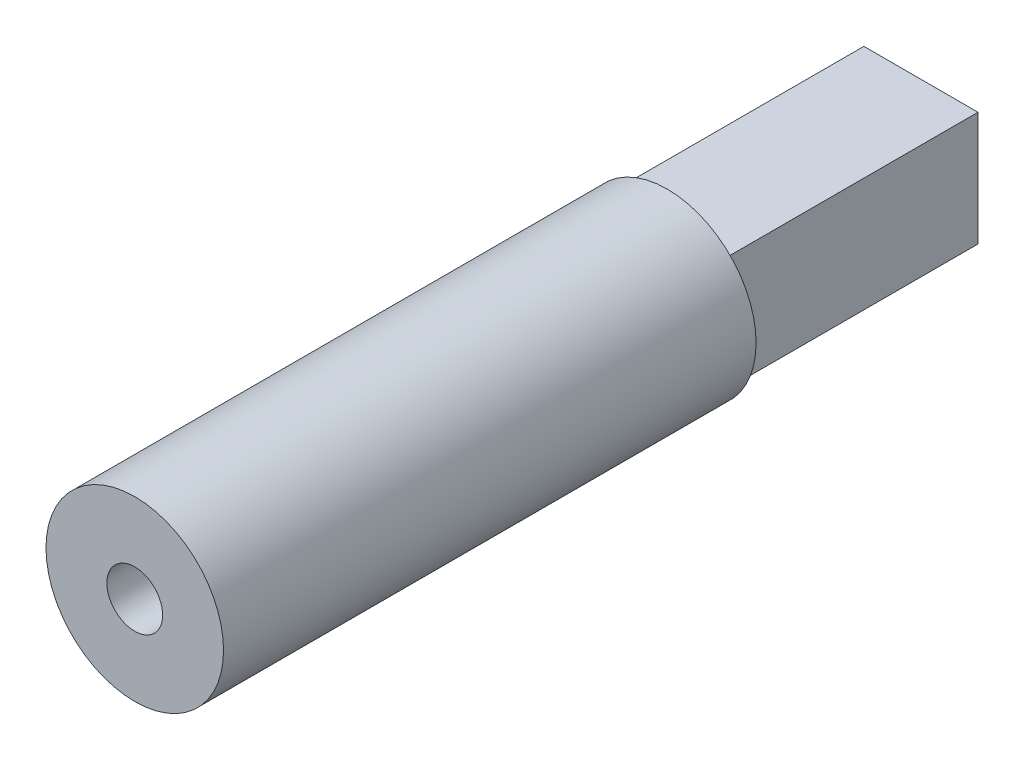
ISO-10303-21;
HEADER;
FILE_DESCRIPTION(('STEP AP214'),'2;1');
FILE_NAME('part.step','',(''),(''),'','','');
FILE_SCHEMA(('AUTOMOTIVE_DESIGN { 1 0 10303 214 1 1 1 1 }'));
ENDSEC;
DATA;
#1=APPLICATION_CONTEXT('core data for automotive mechanical design processes');
#2=APPLICATION_PROTOCOL_DEFINITION('international standard','automotive_design',2000,#1);
#3=PRODUCT_CONTEXT('',#1,'mechanical');
#4=PRODUCT('Part','Part','',(#3));
#5=PRODUCT_RELATED_PRODUCT_CATEGORY('part','',(#4));
#6=PRODUCT_DEFINITION_FORMATION('','',#4);
#7=PRODUCT_DEFINITION_CONTEXT('part definition',#1,'design');
#8=PRODUCT_DEFINITION('design','',#6,#7);
#9=PRODUCT_DEFINITION_SHAPE('','',#8);
#10=(LENGTH_UNIT() NAMED_UNIT(*) SI_UNIT(.MILLI.,.METRE.));
#11=(NAMED_UNIT(*) PLANE_ANGLE_UNIT() SI_UNIT($,.RADIAN.));
#12=(NAMED_UNIT(*) SI_UNIT($,.STERADIAN.) SOLID_ANGLE_UNIT());
#13=UNCERTAINTY_MEASURE_WITH_UNIT(LENGTH_MEASURE(1.E-05),#10,'distance_accuracy_value','');
#14=(GEOMETRIC_REPRESENTATION_CONTEXT(3) GLOBAL_UNCERTAINTY_ASSIGNED_CONTEXT((#13)) GLOBAL_UNIT_ASSIGNED_CONTEXT((#10,
#11,#12)) REPRESENTATION_CONTEXT('',''));
#15=CARTESIAN_POINT('',(0.,0.,0.));
#16=DIRECTION('',(0.,0.,1.));
#17=DIRECTION('',(1.,0.,0.));
#18=AXIS2_PLACEMENT_3D('',#15,#16,#17);
#19=CARTESIAN_POINT('',(0.,0.,31.));
#20=DIRECTION('',(0.,0.,-1.));
#21=DIRECTION('',(-1.,0.,0.));
#22=AXIS2_PLACEMENT_3D('',#19,#20,#21);
#23=CYLINDRICAL_SURFACE('',#22,3.5);
#24=CARTESIAN_POINT('',(0.,0.,31.));
#25=DIRECTION('',(0.,0.,1.));
#26=DIRECTION('',(1.,0.,0.));
#27=AXIS2_PLACEMENT_3D('',#24,#25,#26);
#28=CIRCLE('',#27,3.5);
#29=CARTESIAN_POINT('',(3.5,0.,31.));
#30=VERTEX_POINT('',#29);
#31=EDGE_CURVE('E11',#30,#30,#28,.T.);
#32=ORIENTED_EDGE('',*,*,#31,.F.);
#33=EDGE_LOOP('',(#32));
#34=FACE_BOUND('',#33,.T.);
#35=CARTESIAN_POINT('',(0.,0.,10.));
#36=DIRECTION('',(0.,0.,-1.));
#37=DIRECTION('',(-1.,0.,0.));
#38=AXIS2_PLACEMENT_3D('',#35,#36,#37);
#39=CIRCLE('',#38,3.5);
#40=CARTESIAN_POINT('',(-3.5,0.,10.));
#41=VERTEX_POINT('',#40);
#42=EDGE_CURVE('E48',#41,#41,#39,.T.);
#43=ORIENTED_EDGE('',*,*,#42,.F.);
#44=EDGE_LOOP('',(#43));
#45=FACE_BOUND('',#44,.T.);
#46=ADVANCED_FACE('F41',(#34,#45),#23,.T.);
#47=CARTESIAN_POINT('',(0.,0.,31.));
#48=DIRECTION('',(0.,0.,1.));
#49=DIRECTION('',(1.,0.,0.));
#50=AXIS2_PLACEMENT_3D('',#47,#48,#49);
#51=PLANE('',#50);
#52=CARTESIAN_POINT('',(0.,0.,31.));
#53=DIRECTION('',(0.,0.,1.));
#54=DIRECTION('',(1.,0.,0.));
#55=AXIS2_PLACEMENT_3D('',#52,#53,#54);
#56=CIRCLE('',#55,1.1);
#57=CARTESIAN_POINT('',(1.1,0.,31.));
#58=VERTEX_POINT('',#57);
#59=EDGE_CURVE('E108',#58,#58,#56,.T.);
#60=ORIENTED_EDGE('',*,*,#59,.F.);
#61=EDGE_LOOP('',(#60));
#62=FACE_BOUND('',#61,.T.);
#63=ORIENTED_EDGE('',*,*,#31,.T.);
#64=EDGE_LOOP('',(#63));
#65=FACE_BOUND('',#64,.T.);
#66=ADVANCED_FACE('F125',(#62,#65),#51,.T.);
#67=CARTESIAN_POINT('',(0.,0.,10.));
#68=DIRECTION('',(0.,0.,-1.));
#69=DIRECTION('',(-1.,0.,0.));
#70=AXIS2_PLACEMENT_3D('',#67,#68,#69);
#71=PLANE('',#70);
#72=DIRECTION('',(-1.,0.,0.));
#73=VECTOR('',#72,1.);
#74=CARTESIAN_POINT('',(2.25,-2.25,10.));
#75=LINE('',#74,#73);
#76=CARTESIAN_POINT('',(2.25,-2.25,10.));
#77=VERTEX_POINT('',#76);
#78=CARTESIAN_POINT('',(-2.25,-2.25,10.));
#79=VERTEX_POINT('',#78);
#80=EDGE_CURVE('E93',#77,#79,#75,.T.);
#81=ORIENTED_EDGE('',*,*,#80,.F.);
#82=DIRECTION('',(0.,-1.,0.));
#83=VECTOR('',#82,1.);
#84=CARTESIAN_POINT('',(2.25,2.25,10.));
#85=LINE('',#84,#83);
#86=CARTESIAN_POINT('',(2.25,2.25,10.));
#87=VERTEX_POINT('',#86);
#88=EDGE_CURVE('E63',#87,#77,#85,.T.);
#89=ORIENTED_EDGE('',*,*,#88,.F.);
#90=DIRECTION('',(1.,0.,0.));
#91=VECTOR('',#90,1.);
#92=CARTESIAN_POINT('',(2.25,2.25,10.));
#93=LINE('',#92,#91);
#94=CARTESIAN_POINT('',(-2.25,2.25,10.));
#95=VERTEX_POINT('',#94);
#96=EDGE_CURVE('E85',#95,#87,#93,.T.);
#97=ORIENTED_EDGE('',*,*,#96,.F.);
#98=DIRECTION('',(0.,1.,0.));
#99=VECTOR('',#98,1.);
#100=CARTESIAN_POINT('',(-2.25,2.25,10.));
#101=LINE('',#100,#99);
#102=EDGE_CURVE('E98',#79,#95,#101,.T.);
#103=ORIENTED_EDGE('',*,*,#102,.F.);
#104=EDGE_LOOP('',(#81,#89,#97,#103));
#105=FACE_BOUND('',#104,.T.);
#106=ORIENTED_EDGE('',*,*,#42,.T.);
#107=EDGE_LOOP('',(#106));
#108=FACE_BOUND('',#107,.T.);
#109=ADVANCED_FACE('F96',(#105,#108),#71,.T.);
#110=CARTESIAN_POINT('',(-2.25,2.25,10.));
#111=DIRECTION('',(-1.,0.,0.));
#112=DIRECTION('',(0.,-1.,0.));
#113=AXIS2_PLACEMENT_3D('',#110,#111,#112);
#114=PLANE('',#113);
#115=DIRECTION('',(0.,1.,0.));
#116=VECTOR('',#115,1.);
#117=CARTESIAN_POINT('',(-2.25,2.25,0.));
#118=LINE('',#117,#116);
#119=CARTESIAN_POINT('',(-2.25,-2.25,0.));
#120=VERTEX_POINT('',#119);
#121=CARTESIAN_POINT('',(-2.25,2.25,0.));
#122=VERTEX_POINT('',#121);
#123=EDGE_CURVE('E113',#120,#122,#118,.T.);
#124=ORIENTED_EDGE('',*,*,#123,.F.);
#125=DIRECTION('',(0.,0.,-1.));
#126=VECTOR('',#125,1.);
#127=CARTESIAN_POINT('',(-2.25,-2.25,10.));
#128=LINE('',#127,#126);
#129=EDGE_CURVE('E102',#79,#120,#128,.T.);
#130=ORIENTED_EDGE('',*,*,#129,.F.);
#131=ORIENTED_EDGE('',*,*,#102,.T.);
#132=DIRECTION('',(0.,0.,-1.));
#133=VECTOR('',#132,1.);
#134=CARTESIAN_POINT('',(-2.25,2.25,10.));
#135=LINE('',#134,#133);
#136=EDGE_CURVE('E83',#95,#122,#135,.T.);
#137=ORIENTED_EDGE('',*,*,#136,.T.);
#138=EDGE_LOOP('',(#124,#130,#131,#137));
#139=FACE_BOUND('',#138,.T.);
#140=ADVANCED_FACE('F101',(#139),#114,.T.);
#141=CARTESIAN_POINT('',(2.25,-2.25,10.));
#142=DIRECTION('',(0.,-1.,0.));
#143=DIRECTION('',(0.,0.,-1.));
#144=AXIS2_PLACEMENT_3D('',#141,#142,#143);
#145=PLANE('',#144);
#146=DIRECTION('',(-1.,0.,0.));
#147=VECTOR('',#146,1.);
#148=CARTESIAN_POINT('',(2.25,-2.25,0.));
#149=LINE('',#148,#147);
#150=CARTESIAN_POINT('',(2.25,-2.25,0.));
#151=VERTEX_POINT('',#150);
#152=EDGE_CURVE('E103',#151,#120,#149,.T.);
#153=ORIENTED_EDGE('',*,*,#152,.F.);
#154=DIRECTION('',(0.,0.,-1.));
#155=VECTOR('',#154,1.);
#156=CARTESIAN_POINT('',(2.25,-2.25,10.));
#157=LINE('',#156,#155);
#158=EDGE_CURVE('E119',#77,#151,#157,.T.);
#159=ORIENTED_EDGE('',*,*,#158,.F.);
#160=ORIENTED_EDGE('',*,*,#80,.T.);
#161=ORIENTED_EDGE('',*,*,#129,.T.);
#162=EDGE_LOOP('',(#153,#159,#160,#161));
#163=FACE_BOUND('',#162,.T.);
#164=ADVANCED_FACE('F155',(#163),#145,.T.);
#165=CARTESIAN_POINT('',(2.25,2.25,10.));
#166=DIRECTION('',(1.,0.,0.));
#167=DIRECTION('',(0.,1.,0.));
#168=AXIS2_PLACEMENT_3D('',#165,#166,#167);
#169=PLANE('',#168);
#170=DIRECTION('',(0.,-1.,0.));
#171=VECTOR('',#170,1.);
#172=CARTESIAN_POINT('',(2.25,2.25,0.));
#173=LINE('',#172,#171);
#174=CARTESIAN_POINT('',(2.25,2.25,0.));
#175=VERTEX_POINT('',#174);
#176=EDGE_CURVE('E55',#175,#151,#173,.T.);
#177=ORIENTED_EDGE('',*,*,#176,.F.);
#178=DIRECTION('',(0.,0.,-1.));
#179=VECTOR('',#178,1.);
#180=CARTESIAN_POINT('',(2.25,2.25,10.));
#181=LINE('',#180,#179);
#182=EDGE_CURVE('E92',#87,#175,#181,.T.);
#183=ORIENTED_EDGE('',*,*,#182,.F.);
#184=ORIENTED_EDGE('',*,*,#88,.T.);
#185=ORIENTED_EDGE('',*,*,#158,.T.);
#186=EDGE_LOOP('',(#177,#183,#184,#185));
#187=FACE_BOUND('',#186,.T.);
#188=ADVANCED_FACE('F151',(#187),#169,.T.);
#189=CARTESIAN_POINT('',(2.25,2.25,10.));
#190=DIRECTION('',(0.,1.,0.));
#191=DIRECTION('',(0.,0.,1.));
#192=AXIS2_PLACEMENT_3D('',#189,#190,#191);
#193=PLANE('',#192);
#194=DIRECTION('',(1.,0.,0.));
#195=VECTOR('',#194,1.);
#196=CARTESIAN_POINT('',(2.25,2.25,0.));
#197=LINE('',#196,#195);
#198=EDGE_CURVE('E87',#122,#175,#197,.T.);
#199=ORIENTED_EDGE('',*,*,#198,.F.);
#200=ORIENTED_EDGE('',*,*,#136,.F.);
#201=ORIENTED_EDGE('',*,*,#96,.T.);
#202=ORIENTED_EDGE('',*,*,#182,.T.);
#203=EDGE_LOOP('',(#199,#200,#201,#202));
#204=FACE_BOUND('',#203,.T.);
#205=ADVANCED_FACE('F84',(#204),#193,.T.);
#206=CARTESIAN_POINT('',(0.,0.,0.));
#207=DIRECTION('',(0.,0.,1.));
#208=DIRECTION('',(1.,0.,0.));
#209=AXIS2_PLACEMENT_3D('',#206,#207,#208);
#210=PLANE('',#209);
#211=ORIENTED_EDGE('',*,*,#123,.T.);
#212=ORIENTED_EDGE('',*,*,#198,.T.);
#213=ORIENTED_EDGE('',*,*,#176,.T.);
#214=ORIENTED_EDGE('',*,*,#152,.T.);
#215=EDGE_LOOP('',(#211,#212,#213,#214));
#216=FACE_BOUND('',#215,.T.);
#217=ADVANCED_FACE('F142',(#216),#210,.F.);
#218=CARTESIAN_POINT('',(0.,0.,25.));
#219=DIRECTION('',(0.,0.,1.));
#220=DIRECTION('',(1.,0.,0.));
#221=AXIS2_PLACEMENT_3D('',#218,#219,#220);
#222=CYLINDRICAL_SURFACE('',#221,1.1);
#223=CARTESIAN_POINT('',(0.,0.,25.));
#224=DIRECTION('',(0.,0.,1.));
#225=DIRECTION('',(1.,0.,0.));
#226=AXIS2_PLACEMENT_3D('',#223,#224,#225);
#227=CIRCLE('',#226,1.1);
#228=CARTESIAN_POINT('',(1.1,0.,25.));
#229=VERTEX_POINT('',#228);
#230=EDGE_CURVE('E115',#229,#229,#227,.T.);
#231=ORIENTED_EDGE('',*,*,#230,.F.);
#232=EDGE_LOOP('',(#231));
#233=FACE_BOUND('',#232,.T.);
#234=ORIENTED_EDGE('',*,*,#59,.T.);
#235=EDGE_LOOP('',(#234));
#236=FACE_BOUND('',#235,.T.);
#237=ADVANCED_FACE('F143',(#233,#236),#222,.F.);
#238=CARTESIAN_POINT('',(0.,0.,25.));
#239=DIRECTION('',(0.,0.,1.));
#240=DIRECTION('',(1.,0.,0.));
#241=AXIS2_PLACEMENT_3D('',#238,#239,#240);
#242=PLANE('',#241);
#243=ORIENTED_EDGE('',*,*,#230,.T.);
#244=EDGE_LOOP('',(#243));
#245=FACE_BOUND('',#244,.T.);
#246=ADVANCED_FACE('F148',(#245),#242,.T.);
#247=CLOSED_SHELL('',(#46,#66,#109,#140,#164,#188,#205,#217,#237,#246));
#248=MANIFOLD_SOLID_BREP('B2',#247);
#249=ADVANCED_BREP_SHAPE_REPRESENTATION('',(#18,#248),#14);
#250=SHAPE_DEFINITION_REPRESENTATION(#9,#249);
ENDSEC;
END-ISO-10303-21;
